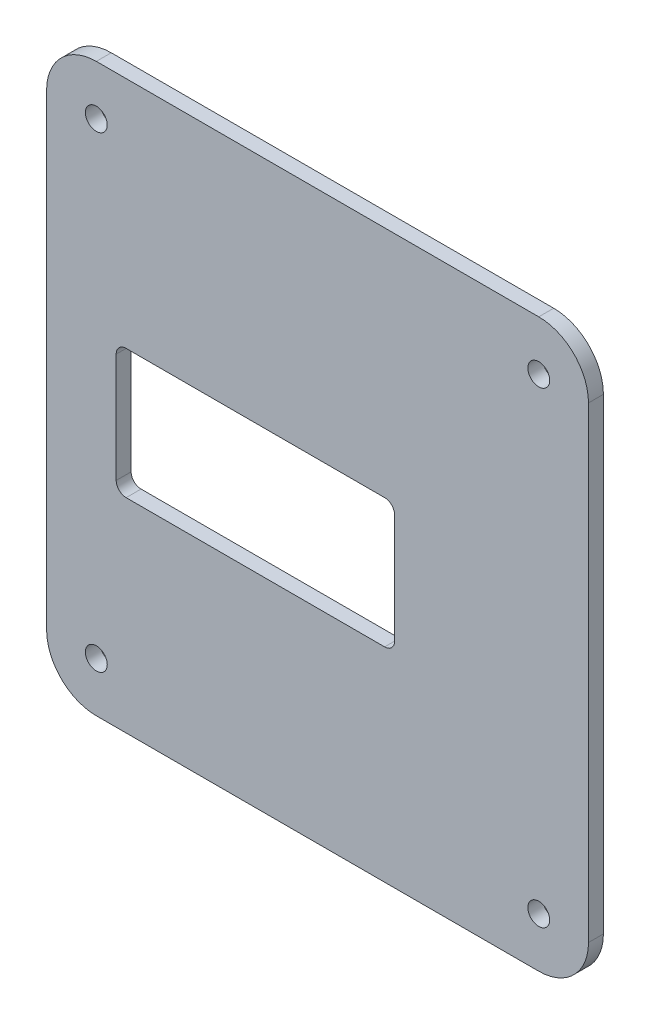
ISO-10303-21;
HEADER;
FILE_DESCRIPTION(('STEP AP214'),'2;1');
FILE_NAME('part.step','',(''),(''),'','','');
FILE_SCHEMA(('AUTOMOTIVE_DESIGN { 1 0 10303 214 1 1 1 1 }'));
ENDSEC;
DATA;
#1=APPLICATION_CONTEXT('core data for automotive mechanical design processes');
#2=APPLICATION_PROTOCOL_DEFINITION('international standard','automotive_design',2000,#1);
#3=PRODUCT_CONTEXT('',#1,'mechanical');
#4=PRODUCT('Part','Part','',(#3));
#5=PRODUCT_RELATED_PRODUCT_CATEGORY('part','',(#4));
#6=PRODUCT_DEFINITION_FORMATION('','',#4);
#7=PRODUCT_DEFINITION_CONTEXT('part definition',#1,'design');
#8=PRODUCT_DEFINITION('design','',#6,#7);
#9=PRODUCT_DEFINITION_SHAPE('','',#8);
#10=(LENGTH_UNIT() NAMED_UNIT(*) SI_UNIT(.MILLI.,.METRE.));
#11=(NAMED_UNIT(*) PLANE_ANGLE_UNIT() SI_UNIT($,.RADIAN.));
#12=(NAMED_UNIT(*) SI_UNIT($,.STERADIAN.) SOLID_ANGLE_UNIT());
#13=UNCERTAINTY_MEASURE_WITH_UNIT(LENGTH_MEASURE(1.E-05),#10,'distance_accuracy_value','');
#14=(GEOMETRIC_REPRESENTATION_CONTEXT(3) GLOBAL_UNCERTAINTY_ASSIGNED_CONTEXT((#13)) GLOBAL_UNIT_ASSIGNED_CONTEXT((#10,
#11,#12)) REPRESENTATION_CONTEXT('',''));
#15=CARTESIAN_POINT('',(0.,0.,0.));
#16=DIRECTION('',(0.,0.,1.));
#17=DIRECTION('',(1.,0.,0.));
#18=AXIS2_PLACEMENT_3D('',#15,#16,#17);
#19=CARTESIAN_POINT('',(0.,0.,3.));
#20=DIRECTION('',(0.,0.,1.));
#21=DIRECTION('',(1.,0.,0.));
#22=AXIS2_PLACEMENT_3D('',#19,#20,#21);
#23=PLANE('',#22);
#24=CARTESIAN_POINT('',(10.,-10.,3.));
#25=DIRECTION('',(0.,0.,1.));
#26=DIRECTION('',(1.,0.,0.));
#27=AXIS2_PLACEMENT_3D('',#24,#25,#26);
#28=CIRCLE('',#27,2.2);
#29=CARTESIAN_POINT('',(12.2,-10.,3.));
#30=VERTEX_POINT('',#29);
#31=EDGE_CURVE('E298',#30,#30,#28,.T.);
#32=ORIENTED_EDGE('',*,*,#31,.F.);
#33=EDGE_LOOP('',(#32));
#34=FACE_BOUND('',#33,.T.);
#35=DIRECTION('',(1.,0.,0.));
#36=VECTOR('',#35,1.);
#37=CARTESIAN_POINT('',(14.,-73.,3.));
#38=LINE('',#37,#36);
#39=CARTESIAN_POINT('',(16.,-73.,3.));
#40=VERTEX_POINT('',#39);
#41=CARTESIAN_POINT('',(68.,-73.,3.));
#42=VERTEX_POINT('',#41);
#43=EDGE_CURVE('E286',#40,#42,#38,.T.);
#44=ORIENTED_EDGE('',*,*,#43,.F.);
#45=CARTESIAN_POINT('',(16.,-71.,3.));
#46=DIRECTION('',(0.,0.,1.));
#47=DIRECTION('',(1.,0.,0.));
#48=AXIS2_PLACEMENT_3D('',#45,#46,#47);
#49=CIRCLE('',#48,2.);
#50=CARTESIAN_POINT('',(14.,-71.,3.));
#51=VERTEX_POINT('',#50);
#52=EDGE_CURVE('E163',#40,#51,#49,.F.);
#53=ORIENTED_EDGE('',*,*,#52,.T.);
#54=DIRECTION('',(0.,-1.,0.));
#55=VECTOR('',#54,1.);
#56=CARTESIAN_POINT('',(14.,-47.,3.));
#57=LINE('',#56,#55);
#58=CARTESIAN_POINT('',(14.,-49.,3.));
#59=VERTEX_POINT('',#58);
#60=EDGE_CURVE('E277',#59,#51,#57,.T.);
#61=ORIENTED_EDGE('',*,*,#60,.F.);
#62=CARTESIAN_POINT('',(16.,-49.,3.));
#63=DIRECTION('',(0.,0.,1.));
#64=DIRECTION('',(1.,0.,0.));
#65=AXIS2_PLACEMENT_3D('',#62,#63,#64);
#66=CIRCLE('',#65,2.);
#67=CARTESIAN_POINT('',(16.,-47.,3.));
#68=VERTEX_POINT('',#67);
#69=EDGE_CURVE('E161',#59,#68,#66,.F.);
#70=ORIENTED_EDGE('',*,*,#69,.T.);
#71=DIRECTION('',(-1.,0.,0.));
#72=VECTOR('',#71,1.);
#73=CARTESIAN_POINT('',(14.,-47.,3.));
#74=LINE('',#73,#72);
#75=CARTESIAN_POINT('',(68.,-47.,3.));
#76=VERTEX_POINT('',#75);
#77=EDGE_CURVE('E272',#76,#68,#74,.T.);
#78=ORIENTED_EDGE('',*,*,#77,.F.);
#79=CARTESIAN_POINT('',(68.,-49.,3.));
#80=DIRECTION('',(0.,0.,1.));
#81=DIRECTION('',(1.,0.,0.));
#82=AXIS2_PLACEMENT_3D('',#79,#80,#81);
#83=CIRCLE('',#82,2.);
#84=CARTESIAN_POINT('',(70.,-49.,3.));
#85=VERTEX_POINT('',#84);
#86=EDGE_CURVE('E208',#76,#85,#83,.F.);
#87=ORIENTED_EDGE('',*,*,#86,.T.);
#88=DIRECTION('',(0.,1.,0.));
#89=VECTOR('',#88,1.);
#90=CARTESIAN_POINT('',(70.,-47.,3.));
#91=LINE('',#90,#89);
#92=CARTESIAN_POINT('',(70.,-71.,3.));
#93=VERTEX_POINT('',#92);
#94=EDGE_CURVE('E287',#93,#85,#91,.T.);
#95=ORIENTED_EDGE('',*,*,#94,.F.);
#96=CARTESIAN_POINT('',(68.,-71.,3.));
#97=DIRECTION('',(0.,0.,1.));
#98=DIRECTION('',(1.,0.,0.));
#99=AXIS2_PLACEMENT_3D('',#96,#97,#98);
#100=CIRCLE('',#99,2.);
#101=EDGE_CURVE('E211',#93,#42,#100,.F.);
#102=ORIENTED_EDGE('',*,*,#101,.T.);
#103=EDGE_LOOP('',(#44,#53,#61,#70,#78,#87,#95,#102));
#104=FACE_BOUND('',#103,.T.);
#105=CARTESIAN_POINT('',(99.,-10.,3.));
#106=DIRECTION('',(0.,0.,1.));
#107=DIRECTION('',(1.,0.,0.));
#108=AXIS2_PLACEMENT_3D('',#105,#106,#107);
#109=CIRCLE('',#108,2.2);
#110=CARTESIAN_POINT('',(101.2,-10.,3.));
#111=VERTEX_POINT('',#110);
#112=EDGE_CURVE('E261',#111,#111,#109,.T.);
#113=ORIENTED_EDGE('',*,*,#112,.F.);
#114=EDGE_LOOP('',(#113));
#115=FACE_BOUND('',#114,.T.);
#116=DIRECTION('',(-1.,0.,0.));
#117=VECTOR('',#116,1.);
#118=CARTESIAN_POINT('',(0.,0.,3.));
#119=LINE('',#118,#117);
#120=CARTESIAN_POINT('',(99.,0.,3.));
#121=VERTEX_POINT('',#120);
#122=CARTESIAN_POINT('',(10.,0.,3.));
#123=VERTEX_POINT('',#122);
#124=EDGE_CURVE('E178',#121,#123,#119,.T.);
#125=ORIENTED_EDGE('',*,*,#124,.T.);
#126=CARTESIAN_POINT('',(10.,-10.,3.));
#127=DIRECTION('',(0.,0.,1.));
#128=DIRECTION('',(1.,0.,0.));
#129=AXIS2_PLACEMENT_3D('',#126,#127,#128);
#130=CIRCLE('',#129,10.);
#131=CARTESIAN_POINT('',(0.,-10.,3.));
#132=VERTEX_POINT('',#131);
#133=EDGE_CURVE('E236',#123,#132,#130,.T.);
#134=ORIENTED_EDGE('',*,*,#133,.T.);
#135=DIRECTION('',(0.,-1.,0.));
#136=VECTOR('',#135,1.);
#137=CARTESIAN_POINT('',(0.,0.,3.));
#138=LINE('',#137,#136);
#139=CARTESIAN_POINT('',(0.,-104.,3.));
#140=VERTEX_POINT('',#139);
#141=EDGE_CURVE('E268',#132,#140,#138,.T.);
#142=ORIENTED_EDGE('',*,*,#141,.T.);
#143=CARTESIAN_POINT('',(10.,-104.,3.));
#144=DIRECTION('',(0.,0.,1.));
#145=DIRECTION('',(1.,0.,0.));
#146=AXIS2_PLACEMENT_3D('',#143,#144,#145);
#147=CIRCLE('',#146,10.);
#148=CARTESIAN_POINT('',(10.,-114.,3.));
#149=VERTEX_POINT('',#148);
#150=EDGE_CURVE('E240',#140,#149,#147,.T.);
#151=ORIENTED_EDGE('',*,*,#150,.T.);
#152=DIRECTION('',(1.,0.,0.));
#153=VECTOR('',#152,1.);
#154=CARTESIAN_POINT('',(0.,-114.,3.));
#155=LINE('',#154,#153);
#156=CARTESIAN_POINT('',(99.,-114.,3.));
#157=VERTEX_POINT('',#156);
#158=EDGE_CURVE('E254',#149,#157,#155,.T.);
#159=ORIENTED_EDGE('',*,*,#158,.T.);
#160=CARTESIAN_POINT('',(99.,-104.,3.));
#161=DIRECTION('',(0.,0.,1.));
#162=DIRECTION('',(1.,0.,0.));
#163=AXIS2_PLACEMENT_3D('',#160,#161,#162);
#164=CIRCLE('',#163,10.);
#165=CARTESIAN_POINT('',(109.,-104.,3.));
#166=VERTEX_POINT('',#165);
#167=EDGE_CURVE('E58',#157,#166,#164,.T.);
#168=ORIENTED_EDGE('',*,*,#167,.T.);
#169=DIRECTION('',(0.,1.,0.));
#170=VECTOR('',#169,1.);
#171=CARTESIAN_POINT('',(109.,0.,3.));
#172=LINE('',#171,#170);
#173=CARTESIAN_POINT('',(109.,-9.99999999999999,3.));
#174=VERTEX_POINT('',#173);
#175=EDGE_CURVE('E184',#166,#174,#172,.T.);
#176=ORIENTED_EDGE('',*,*,#175,.T.);
#177=CARTESIAN_POINT('',(99.,-10.,3.));
#178=DIRECTION('',(0.,0.,1.));
#179=DIRECTION('',(1.,0.,0.));
#180=AXIS2_PLACEMENT_3D('',#177,#178,#179);
#181=CIRCLE('',#180,10.);
#182=EDGE_CURVE('E234',#174,#121,#181,.T.);
#183=ORIENTED_EDGE('',*,*,#182,.T.);
#184=EDGE_LOOP('',(#125,#134,#142,#151,#159,#168,#176,#183));
#185=FACE_BOUND('',#184,.T.);
#186=CARTESIAN_POINT('',(99.,-104.,3.));
#187=DIRECTION('',(0.,0.,1.));
#188=DIRECTION('',(1.,0.,0.));
#189=AXIS2_PLACEMENT_3D('',#186,#187,#188);
#190=CIRCLE('',#189,2.2);
#191=CARTESIAN_POINT('',(101.2,-104.,3.));
#192=VERTEX_POINT('',#191);
#193=EDGE_CURVE('E177',#192,#192,#190,.T.);
#194=ORIENTED_EDGE('',*,*,#193,.F.);
#195=EDGE_LOOP('',(#194));
#196=FACE_BOUND('',#195,.T.);
#197=CARTESIAN_POINT('',(10.,-104.,3.));
#198=DIRECTION('',(0.,0.,1.));
#199=DIRECTION('',(1.,0.,0.));
#200=AXIS2_PLACEMENT_3D('',#197,#198,#199);
#201=CIRCLE('',#200,2.19999999999999);
#202=CARTESIAN_POINT('',(12.2,-104.,3.));
#203=VERTEX_POINT('',#202);
#204=EDGE_CURVE('E305',#203,#203,#201,.T.);
#205=ORIENTED_EDGE('',*,*,#204,.F.);
#206=EDGE_LOOP('',(#205));
#207=FACE_BOUND('',#206,.T.);
#208=ADVANCED_FACE('F39',(#34,#104,#115,#185,#196,#207),#23,.T.);
#209=CARTESIAN_POINT('',(0.,0.,0.));
#210=DIRECTION('',(0.,0.,1.));
#211=DIRECTION('',(1.,0.,0.));
#212=AXIS2_PLACEMENT_3D('',#209,#210,#211);
#213=PLANE('',#212);
#214=CARTESIAN_POINT('',(99.,-10.,0.));
#215=DIRECTION('',(0.,0.,1.));
#216=DIRECTION('',(1.,0.,0.));
#217=AXIS2_PLACEMENT_3D('',#214,#215,#216);
#218=CIRCLE('',#217,2.2);
#219=CARTESIAN_POINT('',(101.2,-10.,0.));
#220=VERTEX_POINT('',#219);
#221=EDGE_CURVE('E271',#220,#220,#218,.T.);
#222=ORIENTED_EDGE('',*,*,#221,.T.);
#223=EDGE_LOOP('',(#222));
#224=FACE_BOUND('',#223,.T.);
#225=DIRECTION('',(0.,-1.,0.));
#226=VECTOR('',#225,1.);
#227=CARTESIAN_POINT('',(0.,0.,0.));
#228=LINE('',#227,#226);
#229=CARTESIAN_POINT('',(0.,-10.,0.));
#230=VERTEX_POINT('',#229);
#231=CARTESIAN_POINT('',(0.,-104.,0.));
#232=VERTEX_POINT('',#231);
#233=EDGE_CURVE('E263',#230,#232,#228,.T.);
#234=ORIENTED_EDGE('',*,*,#233,.F.);
#235=CARTESIAN_POINT('',(10.,-10.,0.));
#236=DIRECTION('',(0.,0.,1.));
#237=DIRECTION('',(1.,0.,0.));
#238=AXIS2_PLACEMENT_3D('',#235,#236,#237);
#239=CIRCLE('',#238,10.);
#240=CARTESIAN_POINT('',(10.,0.,0.));
#241=VERTEX_POINT('',#240);
#242=EDGE_CURVE('E230',#230,#241,#239,.F.);
#243=ORIENTED_EDGE('',*,*,#242,.T.);
#244=DIRECTION('',(-1.,0.,0.));
#245=VECTOR('',#244,1.);
#246=CARTESIAN_POINT('',(0.,0.,0.));
#247=LINE('',#246,#245);
#248=CARTESIAN_POINT('',(99.,0.,0.));
#249=VERTEX_POINT('',#248);
#250=EDGE_CURVE('E186',#249,#241,#247,.T.);
#251=ORIENTED_EDGE('',*,*,#250,.F.);
#252=CARTESIAN_POINT('',(99.,-10.,0.));
#253=DIRECTION('',(0.,0.,1.));
#254=DIRECTION('',(1.,0.,0.));
#255=AXIS2_PLACEMENT_3D('',#252,#253,#254);
#256=CIRCLE('',#255,10.);
#257=CARTESIAN_POINT('',(109.,-9.99999999999999,0.));
#258=VERTEX_POINT('',#257);
#259=EDGE_CURVE('E223',#249,#258,#256,.F.);
#260=ORIENTED_EDGE('',*,*,#259,.T.);
#261=DIRECTION('',(0.,1.,0.));
#262=VECTOR('',#261,1.);
#263=CARTESIAN_POINT('',(109.,0.,0.));
#264=LINE('',#263,#262);
#265=CARTESIAN_POINT('',(109.,-104.,0.));
#266=VERTEX_POINT('',#265);
#267=EDGE_CURVE('E259',#266,#258,#264,.T.);
#268=ORIENTED_EDGE('',*,*,#267,.F.);
#269=CARTESIAN_POINT('',(99.,-104.,0.));
#270=DIRECTION('',(0.,0.,1.));
#271=DIRECTION('',(1.,0.,0.));
#272=AXIS2_PLACEMENT_3D('',#269,#270,#271);
#273=CIRCLE('',#272,10.);
#274=CARTESIAN_POINT('',(99.,-114.,0.));
#275=VERTEX_POINT('',#274);
#276=EDGE_CURVE('E222',#266,#275,#273,.F.);
#277=ORIENTED_EDGE('',*,*,#276,.T.);
#278=DIRECTION('',(1.,0.,0.));
#279=VECTOR('',#278,1.);
#280=CARTESIAN_POINT('',(0.,-114.,0.));
#281=LINE('',#280,#279);
#282=CARTESIAN_POINT('',(10.,-114.,0.));
#283=VERTEX_POINT('',#282);
#284=EDGE_CURVE('E252',#283,#275,#281,.T.);
#285=ORIENTED_EDGE('',*,*,#284,.F.);
#286=CARTESIAN_POINT('',(10.,-104.,0.));
#287=DIRECTION('',(0.,0.,1.));
#288=DIRECTION('',(1.,0.,0.));
#289=AXIS2_PLACEMENT_3D('',#286,#287,#288);
#290=CIRCLE('',#289,10.);
#291=EDGE_CURVE('E221',#283,#232,#290,.F.);
#292=ORIENTED_EDGE('',*,*,#291,.T.);
#293=EDGE_LOOP('',(#234,#243,#251,#260,#268,#277,#285,#292));
#294=FACE_BOUND('',#293,.T.);
#295=DIRECTION('',(-1.,0.,0.));
#296=VECTOR('',#295,1.);
#297=CARTESIAN_POINT('',(14.,-47.,0.));
#298=LINE('',#297,#296);
#299=CARTESIAN_POINT('',(68.,-47.,0.));
#300=VERTEX_POINT('',#299);
#301=CARTESIAN_POINT('',(16.,-47.,0.));
#302=VERTEX_POINT('',#301);
#303=EDGE_CURVE('E159',#300,#302,#298,.T.);
#304=ORIENTED_EDGE('',*,*,#303,.T.);
#305=CARTESIAN_POINT('',(16.,-49.,0.));
#306=DIRECTION('',(0.,0.,1.));
#307=DIRECTION('',(1.,0.,0.));
#308=AXIS2_PLACEMENT_3D('',#305,#306,#307);
#309=CIRCLE('',#308,2.);
#310=CARTESIAN_POINT('',(14.,-49.,0.));
#311=VERTEX_POINT('',#310);
#312=EDGE_CURVE('E154',#302,#311,#309,.T.);
#313=ORIENTED_EDGE('',*,*,#312,.T.);
#314=DIRECTION('',(0.,-1.,0.));
#315=VECTOR('',#314,1.);
#316=CARTESIAN_POINT('',(14.,-47.,0.));
#317=LINE('',#316,#315);
#318=CARTESIAN_POINT('',(14.,-71.,0.));
#319=VERTEX_POINT('',#318);
#320=EDGE_CURVE('E160',#311,#319,#317,.T.);
#321=ORIENTED_EDGE('',*,*,#320,.T.);
#322=CARTESIAN_POINT('',(16.,-71.,0.));
#323=DIRECTION('',(0.,0.,1.));
#324=DIRECTION('',(1.,0.,0.));
#325=AXIS2_PLACEMENT_3D('',#322,#323,#324);
#326=CIRCLE('',#325,2.);
#327=CARTESIAN_POINT('',(16.,-73.,0.));
#328=VERTEX_POINT('',#327);
#329=EDGE_CURVE('E203',#319,#328,#326,.T.);
#330=ORIENTED_EDGE('',*,*,#329,.T.);
#331=DIRECTION('',(1.,0.,0.));
#332=VECTOR('',#331,1.);
#333=CARTESIAN_POINT('',(14.,-73.,0.));
#334=LINE('',#333,#332);
#335=CARTESIAN_POINT('',(68.,-73.,0.));
#336=VERTEX_POINT('',#335);
#337=EDGE_CURVE('E171',#328,#336,#334,.T.);
#338=ORIENTED_EDGE('',*,*,#337,.T.);
#339=CARTESIAN_POINT('',(68.,-71.,0.));
#340=DIRECTION('',(0.,0.,1.));
#341=DIRECTION('',(1.,0.,0.));
#342=AXIS2_PLACEMENT_3D('',#339,#340,#341);
#343=CIRCLE('',#342,2.);
#344=CARTESIAN_POINT('',(70.,-71.,0.));
#345=VERTEX_POINT('',#344);
#346=EDGE_CURVE('E215',#336,#345,#343,.T.);
#347=ORIENTED_EDGE('',*,*,#346,.T.);
#348=DIRECTION('',(0.,1.,0.));
#349=VECTOR('',#348,1.);
#350=CARTESIAN_POINT('',(70.,-47.,0.));
#351=LINE('',#350,#349);
#352=CARTESIAN_POINT('',(70.,-49.,0.));
#353=VERTEX_POINT('',#352);
#354=EDGE_CURVE('E278',#345,#353,#351,.T.);
#355=ORIENTED_EDGE('',*,*,#354,.T.);
#356=CARTESIAN_POINT('',(68.,-49.,0.));
#357=DIRECTION('',(0.,0.,1.));
#358=DIRECTION('',(1.,0.,0.));
#359=AXIS2_PLACEMENT_3D('',#356,#357,#358);
#360=CIRCLE('',#359,2.);
#361=EDGE_CURVE('E209',#353,#300,#360,.T.);
#362=ORIENTED_EDGE('',*,*,#361,.T.);
#363=EDGE_LOOP('',(#304,#313,#321,#330,#338,#347,#355,#362));
#364=FACE_BOUND('',#363,.T.);
#365=CARTESIAN_POINT('',(99.,-104.,0.));
#366=DIRECTION('',(0.,0.,1.));
#367=DIRECTION('',(1.,0.,0.));
#368=AXIS2_PLACEMENT_3D('',#365,#366,#367);
#369=CIRCLE('',#368,2.2);
#370=CARTESIAN_POINT('',(101.2,-104.,0.));
#371=VERTEX_POINT('',#370);
#372=EDGE_CURVE('E291',#371,#371,#369,.T.);
#373=ORIENTED_EDGE('',*,*,#372,.T.);
#374=EDGE_LOOP('',(#373));
#375=FACE_BOUND('',#374,.T.);
#376=CARTESIAN_POINT('',(10.,-10.,0.));
#377=DIRECTION('',(0.,0.,1.));
#378=DIRECTION('',(1.,0.,0.));
#379=AXIS2_PLACEMENT_3D('',#376,#377,#378);
#380=CIRCLE('',#379,2.2);
#381=CARTESIAN_POINT('',(12.2,-10.,0.));
#382=VERTEX_POINT('',#381);
#383=EDGE_CURVE('E300',#382,#382,#380,.T.);
#384=ORIENTED_EDGE('',*,*,#383,.T.);
#385=EDGE_LOOP('',(#384));
#386=FACE_BOUND('',#385,.T.);
#387=CARTESIAN_POINT('',(10.,-104.,0.));
#388=DIRECTION('',(0.,0.,1.));
#389=DIRECTION('',(1.,0.,0.));
#390=AXIS2_PLACEMENT_3D('',#387,#388,#389);
#391=CIRCLE('',#390,2.19999999999999);
#392=CARTESIAN_POINT('',(12.2,-104.,0.));
#393=VERTEX_POINT('',#392);
#394=EDGE_CURVE('E303',#393,#393,#391,.T.);
#395=ORIENTED_EDGE('',*,*,#394,.T.);
#396=EDGE_LOOP('',(#395));
#397=FACE_BOUND('',#396,.T.);
#398=ADVANCED_FACE('F153',(#224,#294,#364,#375,#386,#397),#213,.F.);
#399=CARTESIAN_POINT('',(0.,0.,3.));
#400=DIRECTION('',(1.,0.,0.));
#401=DIRECTION('',(0.,1.,0.));
#402=AXIS2_PLACEMENT_3D('',#399,#400,#401);
#403=PLANE('',#402);
#404=ORIENTED_EDGE('',*,*,#141,.F.);
#405=DIRECTION('',(0.,0.,-1.));
#406=VECTOR('',#405,1.);
#407=CARTESIAN_POINT('',(0.,-10.,3.));
#408=LINE('',#407,#406);
#409=EDGE_CURVE('E216',#132,#230,#408,.T.);
#410=ORIENTED_EDGE('',*,*,#409,.T.);
#411=ORIENTED_EDGE('',*,*,#233,.T.);
#412=DIRECTION('',(0.,0.,-1.));
#413=VECTOR('',#412,1.);
#414=CARTESIAN_POINT('',(0.,-104.,3.));
#415=LINE('',#414,#413);
#416=EDGE_CURVE('E218',#232,#140,#415,.F.);
#417=ORIENTED_EDGE('',*,*,#416,.T.);
#418=EDGE_LOOP('',(#404,#410,#411,#417));
#419=FACE_BOUND('',#418,.T.);
#420=ADVANCED_FACE('F323',(#419),#403,.F.);
#421=CARTESIAN_POINT('',(0.,-114.,3.));
#422=DIRECTION('',(0.,1.,0.));
#423=DIRECTION('',(0.,0.,1.));
#424=AXIS2_PLACEMENT_3D('',#421,#422,#423);
#425=PLANE('',#424);
#426=ORIENTED_EDGE('',*,*,#158,.F.);
#427=DIRECTION('',(0.,0.,-1.));
#428=VECTOR('',#427,1.);
#429=CARTESIAN_POINT('',(10.,-114.,3.));
#430=LINE('',#429,#428);
#431=EDGE_CURVE('E241',#149,#283,#430,.T.);
#432=ORIENTED_EDGE('',*,*,#431,.T.);
#433=ORIENTED_EDGE('',*,*,#284,.T.);
#434=DIRECTION('',(0.,0.,-1.));
#435=VECTOR('',#434,1.);
#436=CARTESIAN_POINT('',(99.,-114.,3.));
#437=LINE('',#436,#435);
#438=EDGE_CURVE('E243',#275,#157,#437,.F.);
#439=ORIENTED_EDGE('',*,*,#438,.T.);
#440=EDGE_LOOP('',(#426,#432,#433,#439));
#441=FACE_BOUND('',#440,.T.);
#442=ADVANCED_FACE('F246',(#441),#425,.F.);
#443=CARTESIAN_POINT('',(109.,0.,3.));
#444=DIRECTION('',(-1.,0.,0.));
#445=DIRECTION('',(0.,-1.,0.));
#446=AXIS2_PLACEMENT_3D('',#443,#444,#445);
#447=PLANE('',#446);
#448=ORIENTED_EDGE('',*,*,#175,.F.);
#449=DIRECTION('',(0.,0.,-1.));
#450=VECTOR('',#449,1.);
#451=CARTESIAN_POINT('',(109.,-104.,3.));
#452=LINE('',#451,#450);
#453=EDGE_CURVE('E11',#166,#266,#452,.T.);
#454=ORIENTED_EDGE('',*,*,#453,.T.);
#455=ORIENTED_EDGE('',*,*,#267,.T.);
#456=DIRECTION('',(0.,0.,-1.));
#457=VECTOR('',#456,1.);
#458=CARTESIAN_POINT('',(109.,-10.,3.));
#459=LINE('',#458,#457);
#460=EDGE_CURVE('E50',#258,#174,#459,.F.);
#461=ORIENTED_EDGE('',*,*,#460,.T.);
#462=EDGE_LOOP('',(#448,#454,#455,#461));
#463=FACE_BOUND('',#462,.T.);
#464=ADVANCED_FACE('F331',(#463),#447,.F.);
#465=CARTESIAN_POINT('',(0.,0.,3.));
#466=DIRECTION('',(0.,-1.,0.));
#467=DIRECTION('',(0.,0.,-1.));
#468=AXIS2_PLACEMENT_3D('',#465,#466,#467);
#469=PLANE('',#468);
#470=ORIENTED_EDGE('',*,*,#250,.T.);
#471=DIRECTION('',(0.,0.,-1.));
#472=VECTOR('',#471,1.);
#473=CARTESIAN_POINT('',(10.,0.,3.));
#474=LINE('',#473,#472);
#475=EDGE_CURVE('E235',#241,#123,#474,.F.);
#476=ORIENTED_EDGE('',*,*,#475,.T.);
#477=ORIENTED_EDGE('',*,*,#124,.F.);
#478=DIRECTION('',(0.,0.,-1.));
#479=VECTOR('',#478,1.);
#480=CARTESIAN_POINT('',(99.,0.,3.));
#481=LINE('',#480,#479);
#482=EDGE_CURVE('E226',#121,#249,#481,.T.);
#483=ORIENTED_EDGE('',*,*,#482,.T.);
#484=EDGE_LOOP('',(#470,#476,#477,#483));
#485=FACE_BOUND('',#484,.T.);
#486=ADVANCED_FACE('F328',(#485),#469,.F.);
#487=CARTESIAN_POINT('',(99.,-10.,3.));
#488=DIRECTION('',(0.,0.,-1.));
#489=DIRECTION('',(-1.,0.,0.));
#490=AXIS2_PLACEMENT_3D('',#487,#488,#489);
#491=CYLINDRICAL_SURFACE('',#490,2.2);
#492=ORIENTED_EDGE('',*,*,#112,.T.);
#493=EDGE_LOOP('',(#492));
#494=FACE_BOUND('',#493,.T.);
#495=ORIENTED_EDGE('',*,*,#221,.F.);
#496=EDGE_LOOP('',(#495));
#497=FACE_BOUND('',#496,.T.);
#498=ADVANCED_FACE('F330',(#494,#497),#491,.F.);
#499=CARTESIAN_POINT('',(14.,-47.,3.));
#500=DIRECTION('',(1.,0.,0.));
#501=DIRECTION('',(0.,1.,0.));
#502=AXIS2_PLACEMENT_3D('',#499,#500,#501);
#503=PLANE('',#502);
#504=ORIENTED_EDGE('',*,*,#60,.T.);
#505=DIRECTION('',(0.,0.,-1.));
#506=VECTOR('',#505,1.);
#507=CARTESIAN_POINT('',(14.,-71.,0.));
#508=LINE('',#507,#506);
#509=EDGE_CURVE('E175',#51,#319,#508,.T.);
#510=ORIENTED_EDGE('',*,*,#509,.T.);
#511=ORIENTED_EDGE('',*,*,#320,.F.);
#512=DIRECTION('',(0.,0.,-1.));
#513=VECTOR('',#512,1.);
#514=CARTESIAN_POINT('',(14.,-49.,3.));
#515=LINE('',#514,#513);
#516=EDGE_CURVE('E173',#311,#59,#515,.F.);
#517=ORIENTED_EDGE('',*,*,#516,.T.);
#518=EDGE_LOOP('',(#504,#510,#511,#517));
#519=FACE_BOUND('',#518,.T.);
#520=ADVANCED_FACE('F167',(#519),#503,.T.);
#521=CARTESIAN_POINT('',(14.,-73.,3.));
#522=DIRECTION('',(0.,1.,0.));
#523=DIRECTION('',(-1.,0.,0.));
#524=AXIS2_PLACEMENT_3D('',#521,#522,#523);
#525=PLANE('',#524);
#526=ORIENTED_EDGE('',*,*,#337,.F.);
#527=DIRECTION('',(0.,0.,-1.));
#528=VECTOR('',#527,1.);
#529=CARTESIAN_POINT('',(16.,-73.,3.));
#530=LINE('',#529,#528);
#531=EDGE_CURVE('E193',#328,#40,#530,.F.);
#532=ORIENTED_EDGE('',*,*,#531,.T.);
#533=ORIENTED_EDGE('',*,*,#43,.T.);
#534=DIRECTION('',(0.,0.,-1.));
#535=VECTOR('',#534,1.);
#536=CARTESIAN_POINT('',(68.,-73.,0.));
#537=LINE('',#536,#535);
#538=EDGE_CURVE('E182',#42,#336,#537,.T.);
#539=ORIENTED_EDGE('',*,*,#538,.T.);
#540=EDGE_LOOP('',(#526,#532,#533,#539));
#541=FACE_BOUND('',#540,.T.);
#542=ADVANCED_FACE('F406',(#541),#525,.T.);
#543=CARTESIAN_POINT('',(70.,-47.,3.));
#544=DIRECTION('',(-1.,0.,0.));
#545=DIRECTION('',(0.,-1.,0.));
#546=AXIS2_PLACEMENT_3D('',#543,#544,#545);
#547=PLANE('',#546);
#548=ORIENTED_EDGE('',*,*,#94,.T.);
#549=DIRECTION('',(0.,0.,-1.));
#550=VECTOR('',#549,1.);
#551=CARTESIAN_POINT('',(70.,-49.,0.));
#552=LINE('',#551,#550);
#553=EDGE_CURVE('E201',#85,#353,#552,.T.);
#554=ORIENTED_EDGE('',*,*,#553,.T.);
#555=ORIENTED_EDGE('',*,*,#354,.F.);
#556=DIRECTION('',(0.,0.,-1.));
#557=VECTOR('',#556,1.);
#558=CARTESIAN_POINT('',(70.,-71.,3.));
#559=LINE('',#558,#557);
#560=EDGE_CURVE('E197',#345,#93,#559,.F.);
#561=ORIENTED_EDGE('',*,*,#560,.T.);
#562=EDGE_LOOP('',(#548,#554,#555,#561));
#563=FACE_BOUND('',#562,.T.);
#564=ADVANCED_FACE('F401',(#563),#547,.T.);
#565=CARTESIAN_POINT('',(14.,-47.,3.));
#566=DIRECTION('',(0.,-1.,0.));
#567=DIRECTION('',(0.,0.,-1.));
#568=AXIS2_PLACEMENT_3D('',#565,#566,#567);
#569=PLANE('',#568);
#570=ORIENTED_EDGE('',*,*,#77,.T.);
#571=DIRECTION('',(0.,0.,-1.));
#572=VECTOR('',#571,1.);
#573=CARTESIAN_POINT('',(16.,-47.,0.));
#574=LINE('',#573,#572);
#575=EDGE_CURVE('E200',#68,#302,#574,.T.);
#576=ORIENTED_EDGE('',*,*,#575,.T.);
#577=ORIENTED_EDGE('',*,*,#303,.F.);
#578=DIRECTION('',(0.,0.,-1.));
#579=VECTOR('',#578,1.);
#580=CARTESIAN_POINT('',(68.,-47.,3.));
#581=LINE('',#580,#579);
#582=EDGE_CURVE('E194',#300,#76,#581,.F.);
#583=ORIENTED_EDGE('',*,*,#582,.T.);
#584=EDGE_LOOP('',(#570,#576,#577,#583));
#585=FACE_BOUND('',#584,.T.);
#586=ADVANCED_FACE('F387',(#585),#569,.T.);
#587=CARTESIAN_POINT('',(99.,-104.,3.));
#588=DIRECTION('',(0.,0.,-1.));
#589=DIRECTION('',(-1.,0.,0.));
#590=AXIS2_PLACEMENT_3D('',#587,#588,#589);
#591=CYLINDRICAL_SURFACE('',#590,2.2);
#592=ORIENTED_EDGE('',*,*,#193,.T.);
#593=EDGE_LOOP('',(#592));
#594=FACE_BOUND('',#593,.T.);
#595=ORIENTED_EDGE('',*,*,#372,.F.);
#596=EDGE_LOOP('',(#595));
#597=FACE_BOUND('',#596,.T.);
#598=ADVANCED_FACE('F385',(#594,#597),#591,.F.);
#599=CARTESIAN_POINT('',(10.,-10.,3.));
#600=DIRECTION('',(0.,0.,-1.));
#601=DIRECTION('',(-1.,0.,0.));
#602=AXIS2_PLACEMENT_3D('',#599,#600,#601);
#603=CYLINDRICAL_SURFACE('',#602,2.2);
#604=ORIENTED_EDGE('',*,*,#31,.T.);
#605=EDGE_LOOP('',(#604));
#606=FACE_BOUND('',#605,.T.);
#607=ORIENTED_EDGE('',*,*,#383,.F.);
#608=EDGE_LOOP('',(#607));
#609=FACE_BOUND('',#608,.T.);
#610=ADVANCED_FACE('F383',(#606,#609),#603,.F.);
#611=CARTESIAN_POINT('',(10.,-104.,3.));
#612=DIRECTION('',(0.,0.,-1.));
#613=DIRECTION('',(-1.,0.,0.));
#614=AXIS2_PLACEMENT_3D('',#611,#612,#613);
#615=CYLINDRICAL_SURFACE('',#614,2.19999999999999);
#616=ORIENTED_EDGE('',*,*,#204,.T.);
#617=EDGE_LOOP('',(#616));
#618=FACE_BOUND('',#617,.T.);
#619=ORIENTED_EDGE('',*,*,#394,.F.);
#620=EDGE_LOOP('',(#619));
#621=FACE_BOUND('',#620,.T.);
#622=ADVANCED_FACE('F312',(#618,#621),#615,.F.);
#623=CARTESIAN_POINT('',(16.,-71.,3.));
#624=DIRECTION('',(0.,0.,1.));
#625=DIRECTION('',(1.,0.,0.));
#626=AXIS2_PLACEMENT_3D('',#623,#624,#625);
#627=CYLINDRICAL_SURFACE('',#626,2.);
#628=ORIENTED_EDGE('',*,*,#52,.F.);
#629=ORIENTED_EDGE('',*,*,#531,.F.);
#630=ORIENTED_EDGE('',*,*,#329,.F.);
#631=ORIENTED_EDGE('',*,*,#509,.F.);
#632=EDGE_LOOP('',(#628,#629,#630,#631));
#633=FACE_BOUND('',#632,.T.);
#634=ADVANCED_FACE('F345',(#633),#627,.F.);
#635=CARTESIAN_POINT('',(16.,-49.,3.));
#636=DIRECTION('',(0.,0.,1.));
#637=DIRECTION('',(1.,0.,0.));
#638=AXIS2_PLACEMENT_3D('',#635,#636,#637);
#639=CYLINDRICAL_SURFACE('',#638,2.);
#640=ORIENTED_EDGE('',*,*,#69,.F.);
#641=ORIENTED_EDGE('',*,*,#516,.F.);
#642=ORIENTED_EDGE('',*,*,#312,.F.);
#643=ORIENTED_EDGE('',*,*,#575,.F.);
#644=EDGE_LOOP('',(#640,#641,#642,#643));
#645=FACE_BOUND('',#644,.T.);
#646=ADVANCED_FACE('F176',(#645),#639,.F.);
#647=CARTESIAN_POINT('',(68.,-49.,3.));
#648=DIRECTION('',(0.,0.,1.));
#649=DIRECTION('',(1.,0.,0.));
#650=AXIS2_PLACEMENT_3D('',#647,#648,#649);
#651=CYLINDRICAL_SURFACE('',#650,2.);
#652=ORIENTED_EDGE('',*,*,#86,.F.);
#653=ORIENTED_EDGE('',*,*,#582,.F.);
#654=ORIENTED_EDGE('',*,*,#361,.F.);
#655=ORIENTED_EDGE('',*,*,#553,.F.);
#656=EDGE_LOOP('',(#652,#653,#654,#655));
#657=FACE_BOUND('',#656,.T.);
#658=ADVANCED_FACE('F348',(#657),#651,.F.);
#659=CARTESIAN_POINT('',(68.,-71.,3.));
#660=DIRECTION('',(0.,0.,1.));
#661=DIRECTION('',(1.,0.,0.));
#662=AXIS2_PLACEMENT_3D('',#659,#660,#661);
#663=CYLINDRICAL_SURFACE('',#662,2.);
#664=ORIENTED_EDGE('',*,*,#101,.F.);
#665=ORIENTED_EDGE('',*,*,#560,.F.);
#666=ORIENTED_EDGE('',*,*,#346,.F.);
#667=ORIENTED_EDGE('',*,*,#538,.F.);
#668=EDGE_LOOP('',(#664,#665,#666,#667));
#669=FACE_BOUND('',#668,.T.);
#670=ADVANCED_FACE('F351',(#669),#663,.F.);
#671=CARTESIAN_POINT('',(10.,-10.,3.));
#672=DIRECTION('',(0.,0.,-1.));
#673=DIRECTION('',(-1.,0.,0.));
#674=AXIS2_PLACEMENT_3D('',#671,#672,#673);
#675=CYLINDRICAL_SURFACE('',#674,10.);
#676=ORIENTED_EDGE('',*,*,#133,.F.);
#677=ORIENTED_EDGE('',*,*,#475,.F.);
#678=ORIENTED_EDGE('',*,*,#242,.F.);
#679=ORIENTED_EDGE('',*,*,#409,.F.);
#680=EDGE_LOOP('',(#676,#677,#678,#679));
#681=FACE_BOUND('',#680,.T.);
#682=ADVANCED_FACE('F353',(#681),#675,.T.);
#683=CARTESIAN_POINT('',(10.,-104.,3.));
#684=DIRECTION('',(0.,0.,-1.));
#685=DIRECTION('',(-1.,0.,0.));
#686=AXIS2_PLACEMENT_3D('',#683,#684,#685);
#687=CYLINDRICAL_SURFACE('',#686,10.);
#688=ORIENTED_EDGE('',*,*,#150,.F.);
#689=ORIENTED_EDGE('',*,*,#416,.F.);
#690=ORIENTED_EDGE('',*,*,#291,.F.);
#691=ORIENTED_EDGE('',*,*,#431,.F.);
#692=EDGE_LOOP('',(#688,#689,#690,#691));
#693=FACE_BOUND('',#692,.T.);
#694=ADVANCED_FACE('F359',(#693),#687,.T.);
#695=CARTESIAN_POINT('',(99.,-104.,3.));
#696=DIRECTION('',(0.,0.,-1.));
#697=DIRECTION('',(-1.,0.,0.));
#698=AXIS2_PLACEMENT_3D('',#695,#696,#697);
#699=CYLINDRICAL_SURFACE('',#698,10.);
#700=ORIENTED_EDGE('',*,*,#167,.F.);
#701=ORIENTED_EDGE('',*,*,#438,.F.);
#702=ORIENTED_EDGE('',*,*,#276,.F.);
#703=ORIENTED_EDGE('',*,*,#453,.F.);
#704=EDGE_LOOP('',(#700,#701,#702,#703));
#705=FACE_BOUND('',#704,.T.);
#706=ADVANCED_FACE('F362',(#705),#699,.T.);
#707=CARTESIAN_POINT('',(99.,-10.,3.));
#708=DIRECTION('',(0.,0.,-1.));
#709=DIRECTION('',(-1.,0.,0.));
#710=AXIS2_PLACEMENT_3D('',#707,#708,#709);
#711=CYLINDRICAL_SURFACE('',#710,10.);
#712=ORIENTED_EDGE('',*,*,#182,.F.);
#713=ORIENTED_EDGE('',*,*,#460,.F.);
#714=ORIENTED_EDGE('',*,*,#259,.F.);
#715=ORIENTED_EDGE('',*,*,#482,.F.);
#716=EDGE_LOOP('',(#712,#713,#714,#715));
#717=FACE_BOUND('',#716,.T.);
#718=ADVANCED_FACE('F41',(#717),#711,.T.);
#719=CLOSED_SHELL('',(#208,#398,#420,#442,#464,#486,#498,#520,#542,#564,#586,#598,#610,#622,
#634,#646,#658,#670,#682,#694,#706,#718));
#720=MANIFOLD_SOLID_BREP('B2',#719);
#721=ADVANCED_BREP_SHAPE_REPRESENTATION('',(#18,#720),#14);
#722=SHAPE_DEFINITION_REPRESENTATION(#9,#721);
ENDSEC;
END-ISO-10303-21;
